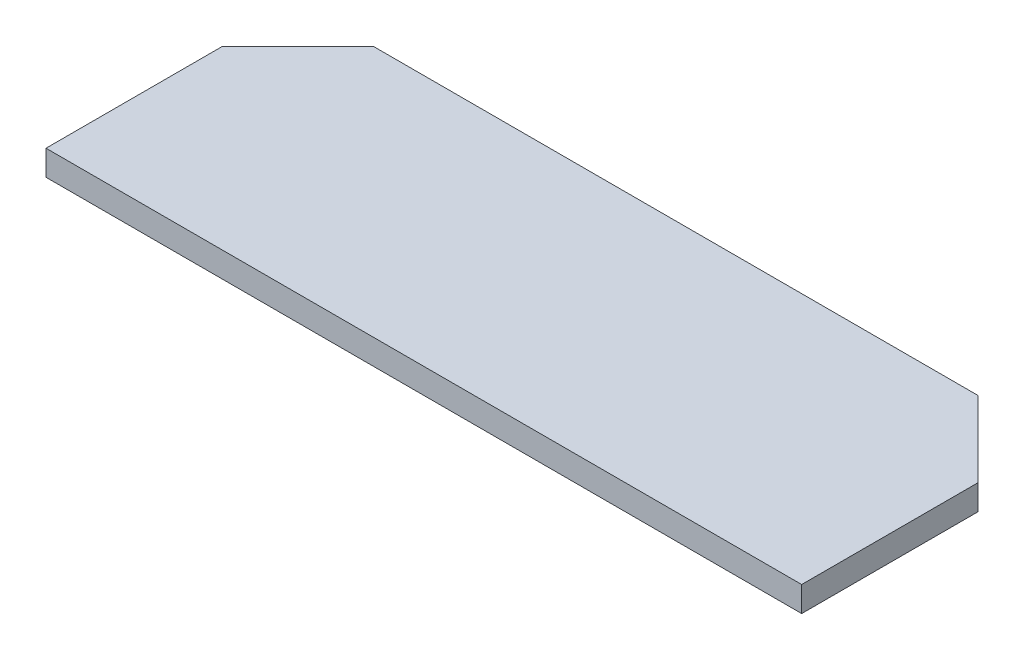
ISO-10303-21;
HEADER;
FILE_DESCRIPTION(('STEP AP214'),'2;1');
FILE_NAME('part.step','',(''),(''),'','','');
FILE_SCHEMA(('AUTOMOTIVE_DESIGN { 1 0 10303 214 1 1 1 1 }'));
ENDSEC;
DATA;
#1=APPLICATION_CONTEXT('core data for automotive mechanical design processes');
#2=APPLICATION_PROTOCOL_DEFINITION('international standard','automotive_design',2000,#1);
#3=PRODUCT_CONTEXT('',#1,'mechanical');
#4=PRODUCT('Part','Part','',(#3));
#5=PRODUCT_RELATED_PRODUCT_CATEGORY('part','',(#4));
#6=PRODUCT_DEFINITION_FORMATION('','',#4);
#7=PRODUCT_DEFINITION_CONTEXT('part definition',#1,'design');
#8=PRODUCT_DEFINITION('design','',#6,#7);
#9=PRODUCT_DEFINITION_SHAPE('','',#8);
#10=(LENGTH_UNIT() NAMED_UNIT(*) SI_UNIT(.MILLI.,.METRE.));
#11=(NAMED_UNIT(*) PLANE_ANGLE_UNIT() SI_UNIT($,.RADIAN.));
#12=(NAMED_UNIT(*) SI_UNIT($,.STERADIAN.) SOLID_ANGLE_UNIT());
#13=UNCERTAINTY_MEASURE_WITH_UNIT(LENGTH_MEASURE(1.E-05),#10,'distance_accuracy_value','');
#14=(GEOMETRIC_REPRESENTATION_CONTEXT(3) GLOBAL_UNCERTAINTY_ASSIGNED_CONTEXT((#13)) GLOBAL_UNIT_ASSIGNED_CONTEXT((#10,
#11,#12)) REPRESENTATION_CONTEXT('',''));
#15=CARTESIAN_POINT('',(0.,0.,0.));
#16=DIRECTION('',(0.,0.,1.));
#17=DIRECTION('',(1.,0.,0.));
#18=AXIS2_PLACEMENT_3D('',#15,#16,#17);
#19=CARTESIAN_POINT('',(-95.25,-6.34999999999997,19.0500000000001));
#20=DIRECTION('',(-0.707106781186548,0.,-0.707106781186548));
#21=DIRECTION('',(-0.707106781186547,0.,0.707106781186549));
#22=AXIS2_PLACEMENT_3D('',#19,#20,#21);
#23=PLANE('',#22);
#24=DIRECTION('',(-0.707106781186547,0.,0.707106781186549));
#25=VECTOR('',#24,1.);
#26=CARTESIAN_POINT('',(-95.25,0.,19.0500000000001));
#27=LINE('',#26,#25);
#28=CARTESIAN_POINT('',(-76.2,0.,0.));
#29=VERTEX_POINT('',#28);
#30=CARTESIAN_POINT('',(-95.25,0.,19.0500000000001));
#31=VERTEX_POINT('',#30);
#32=EDGE_CURVE('E88',#29,#31,#27,.T.);
#33=ORIENTED_EDGE('',*,*,#32,.F.);
#34=DIRECTION('',(0.,1.,0.));
#35=VECTOR('',#34,1.);
#36=CARTESIAN_POINT('',(-76.2,-6.34999999999997,0.));
#37=LINE('',#36,#35);
#38=CARTESIAN_POINT('',(-76.2,-6.34999999999997,0.));
#39=VERTEX_POINT('',#38);
#40=EDGE_CURVE('E11',#39,#29,#37,.T.);
#41=ORIENTED_EDGE('',*,*,#40,.F.);
#42=DIRECTION('',(-0.707106781186547,0.,0.707106781186549));
#43=VECTOR('',#42,1.);
#44=CARTESIAN_POINT('',(-95.25,-6.34999999999997,19.0500000000001));
#45=LINE('',#44,#43);
#46=CARTESIAN_POINT('',(-95.25,-6.34999999999997,19.0500000000001));
#47=VERTEX_POINT('',#46);
#48=EDGE_CURVE('E90',#39,#47,#45,.T.);
#49=ORIENTED_EDGE('',*,*,#48,.T.);
#50=DIRECTION('',(0.,1.,0.));
#51=VECTOR('',#50,1.);
#52=CARTESIAN_POINT('',(-95.25,-6.34999999999997,19.0500000000001));
#53=LINE('',#52,#51);
#54=EDGE_CURVE('E39',#47,#31,#53,.T.);
#55=ORIENTED_EDGE('',*,*,#54,.T.);
#56=EDGE_LOOP('',(#33,#41,#49,#55));
#57=FACE_BOUND('',#56,.T.);
#58=ADVANCED_FACE('F36',(#57),#23,.T.);
#59=CARTESIAN_POINT('',(-76.2,-6.34999999999997,0.));
#60=DIRECTION('',(0.,0.,-1.));
#61=DIRECTION('',(-1.,0.,0.));
#62=AXIS2_PLACEMENT_3D('',#59,#60,#61);
#63=PLANE('',#62);
#64=DIRECTION('',(-1.,0.,0.));
#65=VECTOR('',#64,1.);
#66=CARTESIAN_POINT('',(-76.2,0.,0.));
#67=LINE('',#66,#65);
#68=CARTESIAN_POINT('',(76.2,0.,0.));
#69=VERTEX_POINT('',#68);
#70=EDGE_CURVE('E106',#69,#29,#67,.T.);
#71=ORIENTED_EDGE('',*,*,#70,.F.);
#72=DIRECTION('',(0.,1.,0.));
#73=VECTOR('',#72,1.);
#74=CARTESIAN_POINT('',(76.2,-6.34999999999997,0.));
#75=LINE('',#74,#73);
#76=CARTESIAN_POINT('',(76.2,-6.34999999999997,0.));
#77=VERTEX_POINT('',#76);
#78=EDGE_CURVE('E44',#77,#69,#75,.T.);
#79=ORIENTED_EDGE('',*,*,#78,.F.);
#80=DIRECTION('',(-1.,0.,0.));
#81=VECTOR('',#80,1.);
#82=CARTESIAN_POINT('',(-76.2,-6.34999999999997,0.));
#83=LINE('',#82,#81);
#84=EDGE_CURVE('E95',#77,#39,#83,.T.);
#85=ORIENTED_EDGE('',*,*,#84,.T.);
#86=ORIENTED_EDGE('',*,*,#40,.T.);
#87=EDGE_LOOP('',(#71,#79,#85,#86));
#88=FACE_BOUND('',#87,.T.);
#89=ADVANCED_FACE('F141',(#88),#63,.T.);
#90=CARTESIAN_POINT('',(76.2,-6.34999999999997,0.));
#91=DIRECTION('',(0.707106781186548,0.,-0.707106781186549));
#92=DIRECTION('',(-0.707106781186547,0.,-0.707106781186549));
#93=AXIS2_PLACEMENT_3D('',#90,#91,#92);
#94=PLANE('',#93);
#95=DIRECTION('',(-0.707106781186547,0.,-0.707106781186549));
#96=VECTOR('',#95,1.);
#97=CARTESIAN_POINT('',(76.2,0.,0.));
#98=LINE('',#97,#96);
#99=CARTESIAN_POINT('',(95.25,0.,19.0500000000001));
#100=VERTEX_POINT('',#99);
#101=EDGE_CURVE('E113',#100,#69,#98,.T.);
#102=ORIENTED_EDGE('',*,*,#101,.F.);
#103=DIRECTION('',(0.,1.,0.));
#104=VECTOR('',#103,1.);
#105=CARTESIAN_POINT('',(95.25,-6.34999999999997,19.0500000000001));
#106=LINE('',#105,#104);
#107=CARTESIAN_POINT('',(95.25,-6.34999999999997,19.0500000000001));
#108=VERTEX_POINT('',#107);
#109=EDGE_CURVE('E129',#108,#100,#106,.T.);
#110=ORIENTED_EDGE('',*,*,#109,.F.);
#111=DIRECTION('',(-0.707106781186547,0.,-0.707106781186549));
#112=VECTOR('',#111,1.);
#113=CARTESIAN_POINT('',(76.2,-6.34999999999997,0.));
#114=LINE('',#113,#112);
#115=EDGE_CURVE('E125',#108,#77,#114,.T.);
#116=ORIENTED_EDGE('',*,*,#115,.T.);
#117=ORIENTED_EDGE('',*,*,#78,.T.);
#118=EDGE_LOOP('',(#102,#110,#116,#117));
#119=FACE_BOUND('',#118,.T.);
#120=ADVANCED_FACE('F146',(#119),#94,.T.);
#121=CARTESIAN_POINT('',(95.25,-6.34999999999997,19.0500000000001));
#122=DIRECTION('',(1.,0.,0.));
#123=DIRECTION('',(0.,0.,-1.));
#124=AXIS2_PLACEMENT_3D('',#121,#122,#123);
#125=PLANE('',#124);
#126=DIRECTION('',(0.,0.,-1.));
#127=VECTOR('',#126,1.);
#128=CARTESIAN_POINT('',(95.25,0.,19.0500000000001));
#129=LINE('',#128,#127);
#130=CARTESIAN_POINT('',(95.25,0.,63.5000000000002));
#131=VERTEX_POINT('',#130);
#132=EDGE_CURVE('E110',#131,#100,#129,.T.);
#133=ORIENTED_EDGE('',*,*,#132,.F.);
#134=DIRECTION('',(0.,1.,0.));
#135=VECTOR('',#134,1.);
#136=CARTESIAN_POINT('',(95.25,-6.34999999999997,63.5000000000002));
#137=LINE('',#136,#135);
#138=CARTESIAN_POINT('',(95.25,-6.34999999999997,63.5000000000002));
#139=VERTEX_POINT('',#138);
#140=EDGE_CURVE('E131',#139,#131,#137,.T.);
#141=ORIENTED_EDGE('',*,*,#140,.F.);
#142=DIRECTION('',(0.,0.,-1.));
#143=VECTOR('',#142,1.);
#144=CARTESIAN_POINT('',(95.25,-6.34999999999997,19.0500000000001));
#145=LINE('',#144,#143);
#146=EDGE_CURVE('E122',#139,#108,#145,.T.);
#147=ORIENTED_EDGE('',*,*,#146,.T.);
#148=ORIENTED_EDGE('',*,*,#109,.T.);
#149=EDGE_LOOP('',(#133,#141,#147,#148));
#150=FACE_BOUND('',#149,.T.);
#151=ADVANCED_FACE('F138',(#150),#125,.T.);
#152=CARTESIAN_POINT('',(95.25,-6.34999999999997,63.5000000000002));
#153=DIRECTION('',(0.,0.,1.));
#154=DIRECTION('',(1.,0.,0.));
#155=AXIS2_PLACEMENT_3D('',#152,#153,#154);
#156=PLANE('',#155);
#157=DIRECTION('',(1.,0.,0.));
#158=VECTOR('',#157,1.);
#159=CARTESIAN_POINT('',(95.25,0.,63.5000000000002));
#160=LINE('',#159,#158);
#161=CARTESIAN_POINT('',(-95.25,0.,63.5000000000002));
#162=VERTEX_POINT('',#161);
#163=EDGE_CURVE('E102',#162,#131,#160,.T.);
#164=ORIENTED_EDGE('',*,*,#163,.F.);
#165=DIRECTION('',(0.,1.,0.));
#166=VECTOR('',#165,1.);
#167=CARTESIAN_POINT('',(-95.25,-6.34999999999997,63.5000000000002));
#168=LINE('',#167,#166);
#169=CARTESIAN_POINT('',(-95.25,-6.34999999999997,63.5000000000002));
#170=VERTEX_POINT('',#169);
#171=EDGE_CURVE('E94',#170,#162,#168,.T.);
#172=ORIENTED_EDGE('',*,*,#171,.F.);
#173=DIRECTION('',(1.,0.,0.));
#174=VECTOR('',#173,1.);
#175=CARTESIAN_POINT('',(95.25,-6.34999999999997,63.5000000000002));
#176=LINE('',#175,#174);
#177=EDGE_CURVE('E119',#170,#139,#176,.T.);
#178=ORIENTED_EDGE('',*,*,#177,.T.);
#179=ORIENTED_EDGE('',*,*,#140,.T.);
#180=EDGE_LOOP('',(#164,#172,#178,#179));
#181=FACE_BOUND('',#180,.T.);
#182=ADVANCED_FACE('F134',(#181),#156,.T.);
#183=CARTESIAN_POINT('',(-95.25,-6.34999999999997,63.5000000000002));
#184=DIRECTION('',(-1.,0.,0.));
#185=DIRECTION('',(0.,0.,1.));
#186=AXIS2_PLACEMENT_3D('',#183,#184,#185);
#187=PLANE('',#186);
#188=DIRECTION('',(0.,0.,1.));
#189=VECTOR('',#188,1.);
#190=CARTESIAN_POINT('',(-95.25,0.,63.5000000000002));
#191=LINE('',#190,#189);
#192=EDGE_CURVE('E97',#31,#162,#191,.T.);
#193=ORIENTED_EDGE('',*,*,#192,.F.);
#194=ORIENTED_EDGE('',*,*,#54,.F.);
#195=DIRECTION('',(0.,0.,1.));
#196=VECTOR('',#195,1.);
#197=CARTESIAN_POINT('',(-95.25,-6.34999999999997,63.5000000000002));
#198=LINE('',#197,#196);
#199=EDGE_CURVE('E117',#47,#170,#198,.T.);
#200=ORIENTED_EDGE('',*,*,#199,.T.);
#201=ORIENTED_EDGE('',*,*,#171,.T.);
#202=EDGE_LOOP('',(#193,#194,#200,#201));
#203=FACE_BOUND('',#202,.T.);
#204=ADVANCED_FACE('F98',(#203),#187,.T.);
#205=CARTESIAN_POINT('',(0.,-6.34999999999997,-76.2000000000003));
#206=DIRECTION('',(0.,-1.,0.));
#207=DIRECTION('',(0.,0.,-1.));
#208=AXIS2_PLACEMENT_3D('',#205,#206,#207);
#209=PLANE('',#208);
#210=ORIENTED_EDGE('',*,*,#48,.F.);
#211=ORIENTED_EDGE('',*,*,#84,.F.);
#212=ORIENTED_EDGE('',*,*,#115,.F.);
#213=ORIENTED_EDGE('',*,*,#146,.F.);
#214=ORIENTED_EDGE('',*,*,#177,.F.);
#215=ORIENTED_EDGE('',*,*,#199,.F.);
#216=EDGE_LOOP('',(#210,#211,#212,#213,#214,#215));
#217=FACE_BOUND('',#216,.T.);
#218=ADVANCED_FACE('F145',(#217),#209,.T.);
#219=CARTESIAN_POINT('',(0.,0.,-76.2000000000003));
#220=DIRECTION('',(0.,-1.,0.));
#221=DIRECTION('',(0.,0.,-1.));
#222=AXIS2_PLACEMENT_3D('',#219,#220,#221);
#223=PLANE('',#222);
#224=ORIENTED_EDGE('',*,*,#32,.T.);
#225=ORIENTED_EDGE('',*,*,#192,.T.);
#226=ORIENTED_EDGE('',*,*,#163,.T.);
#227=ORIENTED_EDGE('',*,*,#132,.T.);
#228=ORIENTED_EDGE('',*,*,#101,.T.);
#229=ORIENTED_EDGE('',*,*,#70,.T.);
#230=EDGE_LOOP('',(#224,#225,#226,#227,#228,#229));
#231=FACE_BOUND('',#230,.T.);
#232=ADVANCED_FACE('F104',(#231),#223,.F.);
#233=CLOSED_SHELL('',(#58,#89,#120,#151,#182,#204,#218,#232));
#234=MANIFOLD_SOLID_BREP('B2',#233);
#235=ADVANCED_BREP_SHAPE_REPRESENTATION('',(#18,#234),#14);
#236=SHAPE_DEFINITION_REPRESENTATION(#9,#235);
ENDSEC;
END-ISO-10303-21;
